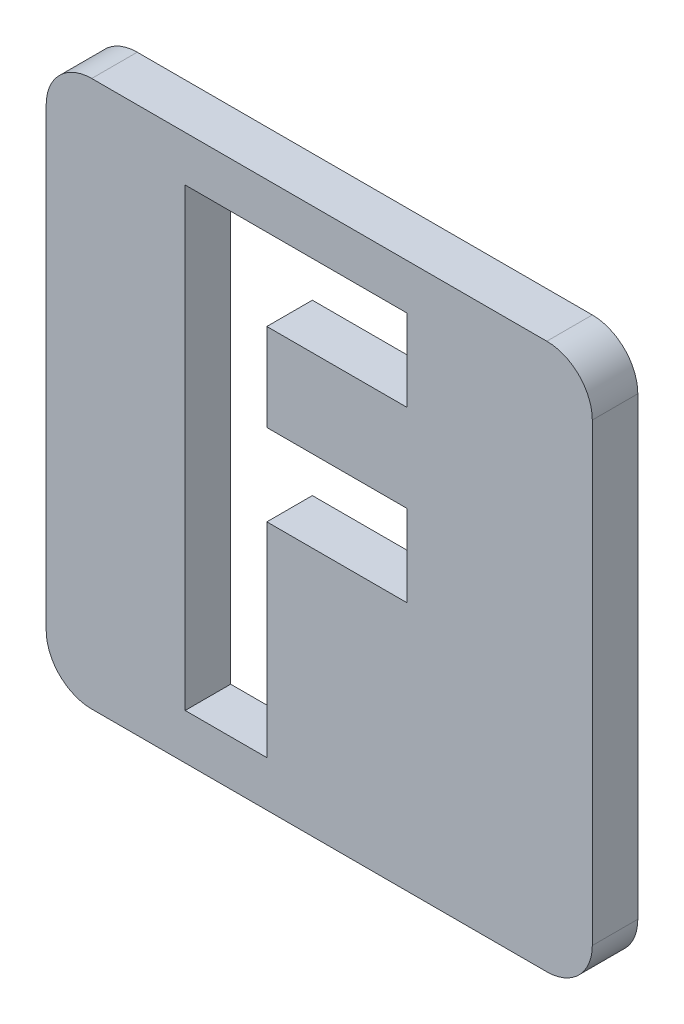
ISO-10303-21;
HEADER;
FILE_DESCRIPTION(('STEP AP214'),'2;1');
FILE_NAME('part.step','',(''),(''),'','','');
FILE_SCHEMA(('AUTOMOTIVE_DESIGN { 1 0 10303 214 1 1 1 1 }'));
ENDSEC;
DATA;
#1=APPLICATION_CONTEXT('core data for automotive mechanical design processes');
#2=APPLICATION_PROTOCOL_DEFINITION('international standard','automotive_design',2000,#1);
#3=PRODUCT_CONTEXT('',#1,'mechanical');
#4=PRODUCT('Part','Part','',(#3));
#5=PRODUCT_RELATED_PRODUCT_CATEGORY('part','',(#4));
#6=PRODUCT_DEFINITION_FORMATION('','',#4);
#7=PRODUCT_DEFINITION_CONTEXT('part definition',#1,'design');
#8=PRODUCT_DEFINITION('design','',#6,#7);
#9=PRODUCT_DEFINITION_SHAPE('','',#8);
#10=(LENGTH_UNIT() NAMED_UNIT(*) SI_UNIT(.MILLI.,.METRE.));
#11=(NAMED_UNIT(*) PLANE_ANGLE_UNIT() SI_UNIT($,.RADIAN.));
#12=(NAMED_UNIT(*) SI_UNIT($,.STERADIAN.) SOLID_ANGLE_UNIT());
#13=UNCERTAINTY_MEASURE_WITH_UNIT(LENGTH_MEASURE(1.E-05),#10,'distance_accuracy_value','');
#14=(GEOMETRIC_REPRESENTATION_CONTEXT(3) GLOBAL_UNCERTAINTY_ASSIGNED_CONTEXT((#13)) GLOBAL_UNIT_ASSIGNED_CONTEXT((#10,
#11,#12)) REPRESENTATION_CONTEXT('',''));
#15=CARTESIAN_POINT('',(0.,0.,0.));
#16=DIRECTION('',(0.,0.,1.));
#17=DIRECTION('',(1.,0.,0.));
#18=AXIS2_PLACEMENT_3D('',#15,#16,#17);
#19=CARTESIAN_POINT('',(50.,50.,10.));
#20=DIRECTION('',(0.,0.,-1.));
#21=DIRECTION('',(-1.,0.,0.));
#22=AXIS2_PLACEMENT_3D('',#19,#20,#21);
#23=PLANE('',#22);
#24=DIRECTION('',(1.,0.,0.));
#25=VECTOR('',#24,1.);
#26=CARTESIAN_POINT('',(-49.9999999999999,60.,10.));
#27=LINE('',#26,#25);
#28=CARTESIAN_POINT('',(-49.9999999999999,60.,10.));
#29=VERTEX_POINT('',#28);
#30=CARTESIAN_POINT('',(49.9999999999999,60.,10.));
#31=VERTEX_POINT('',#30);
#32=EDGE_CURVE('E239',#29,#31,#27,.T.);
#33=ORIENTED_EDGE('',*,*,#32,.F.);
#34=CARTESIAN_POINT('',(-50.,50.,10.));
#35=DIRECTION('',(0.,0.,1.));
#36=DIRECTION('',(1.,0.,0.));
#37=AXIS2_PLACEMENT_3D('',#34,#35,#36);
#38=CIRCLE('',#37,10.);
#39=CARTESIAN_POINT('',(-60.,49.9999999999999,10.));
#40=VERTEX_POINT('',#39);
#41=EDGE_CURVE('E257',#29,#40,#38,.T.);
#42=ORIENTED_EDGE('',*,*,#41,.T.);
#43=DIRECTION('',(0.,-1.,0.));
#44=VECTOR('',#43,1.);
#45=CARTESIAN_POINT('',(-60.,49.9999999999999,10.));
#46=LINE('',#45,#44);
#47=CARTESIAN_POINT('',(-60.,-49.9999999999999,10.));
#48=VERTEX_POINT('',#47);
#49=EDGE_CURVE('E255',#40,#48,#46,.T.);
#50=ORIENTED_EDGE('',*,*,#49,.T.);
#51=CARTESIAN_POINT('',(-50.,-50.,10.));
#52=DIRECTION('',(0.,0.,1.));
#53=DIRECTION('',(1.,0.,0.));
#54=AXIS2_PLACEMENT_3D('',#51,#52,#53);
#55=CIRCLE('',#54,10.);
#56=CARTESIAN_POINT('',(-49.9999999999999,-60.,10.));
#57=VERTEX_POINT('',#56);
#58=EDGE_CURVE('E253',#48,#57,#55,.T.);
#59=ORIENTED_EDGE('',*,*,#58,.T.);
#60=DIRECTION('',(1.,0.,0.));
#61=VECTOR('',#60,1.);
#62=CARTESIAN_POINT('',(-49.9999999999999,-60.,10.));
#63=LINE('',#62,#61);
#64=CARTESIAN_POINT('',(49.9999999999999,-60.,10.));
#65=VERTEX_POINT('',#64);
#66=EDGE_CURVE('E251',#57,#65,#63,.T.);
#67=ORIENTED_EDGE('',*,*,#66,.T.);
#68=CARTESIAN_POINT('',(50.,-50.,10.));
#69=DIRECTION('',(0.,0.,1.));
#70=DIRECTION('',(1.,0.,0.));
#71=AXIS2_PLACEMENT_3D('',#68,#69,#70);
#72=CIRCLE('',#71,10.);
#73=CARTESIAN_POINT('',(60.,-50.,10.));
#74=VERTEX_POINT('',#73);
#75=EDGE_CURVE('E249',#65,#74,#72,.T.);
#76=ORIENTED_EDGE('',*,*,#75,.T.);
#77=DIRECTION('',(0.,-1.,0.));
#78=VECTOR('',#77,1.);
#79=CARTESIAN_POINT('',(60.,49.9999999999999,10.));
#80=LINE('',#79,#78);
#81=CARTESIAN_POINT('',(60.,49.9999999999999,10.));
#82=VERTEX_POINT('',#81);
#83=EDGE_CURVE('E246',#82,#74,#80,.T.);
#84=ORIENTED_EDGE('',*,*,#83,.F.);
#85=CARTESIAN_POINT('',(50.,50.,10.));
#86=DIRECTION('',(0.,0.,-1.));
#87=DIRECTION('',(-1.,0.,0.));
#88=AXIS2_PLACEMENT_3D('',#85,#86,#87);
#89=CIRCLE('',#88,10.);
#90=EDGE_CURVE('E242',#31,#82,#89,.T.);
#91=ORIENTED_EDGE('',*,*,#90,.F.);
#92=EDGE_LOOP('',(#33,#42,#50,#59,#67,#76,#84,#91));
#93=FACE_BOUND('',#92,.T.);
#94=DIRECTION('',(0.,1.,0.));
#95=VECTOR('',#94,1.);
#96=CARTESIAN_POINT('',(-29.4615384615385,-50.,10.));
#97=LINE('',#96,#95);
#98=CARTESIAN_POINT('',(-29.4615384615385,-50.,10.));
#99=VERTEX_POINT('',#98);
#100=CARTESIAN_POINT('',(-29.4615384615385,50.,10.));
#101=VERTEX_POINT('',#100);
#102=EDGE_CURVE('E50',#99,#101,#97,.T.);
#103=ORIENTED_EDGE('',*,*,#102,.T.);
#104=DIRECTION('',(1.,0.,0.));
#105=VECTOR('',#104,1.);
#106=CARTESIAN_POINT('',(-29.4615384615385,50.,10.));
#107=LINE('',#106,#105);
#108=CARTESIAN_POINT('',(19.2564102564103,50.,10.));
#109=VERTEX_POINT('',#108);
#110=EDGE_CURVE('E174',#101,#109,#107,.T.);
#111=ORIENTED_EDGE('',*,*,#110,.T.);
#112=DIRECTION('',(0.,-1.,0.));
#113=VECTOR('',#112,1.);
#114=CARTESIAN_POINT('',(19.2564102564103,50.,10.));
#115=LINE('',#114,#113);
#116=CARTESIAN_POINT('',(19.2564102564103,32.0512820512821,10.));
#117=VERTEX_POINT('',#116);
#118=EDGE_CURVE('E201',#109,#117,#115,.T.);
#119=ORIENTED_EDGE('',*,*,#118,.T.);
#120=DIRECTION('',(-1.,0.,0.));
#121=VECTOR('',#120,1.);
#122=CARTESIAN_POINT('',(19.2564102564103,32.0512820512821,10.));
#123=LINE('',#122,#121);
#124=CARTESIAN_POINT('',(-11.5128205128205,32.0512820512821,10.));
#125=VERTEX_POINT('',#124);
#126=EDGE_CURVE('E204',#117,#125,#123,.T.);
#127=ORIENTED_EDGE('',*,*,#126,.T.);
#128=DIRECTION('',(0.,-1.,0.));
#129=VECTOR('',#128,1.);
#130=CARTESIAN_POINT('',(-11.5128205128205,32.0512820512821,10.));
#131=LINE('',#130,#129);
#132=CARTESIAN_POINT('',(-11.5128205128205,12.8205128205128,10.));
#133=VERTEX_POINT('',#132);
#134=EDGE_CURVE('E207',#125,#133,#131,.T.);
#135=ORIENTED_EDGE('',*,*,#134,.T.);
#136=DIRECTION('',(1.,0.,0.));
#137=VECTOR('',#136,1.);
#138=CARTESIAN_POINT('',(-11.5128205128205,12.8205128205128,10.));
#139=LINE('',#138,#137);
#140=CARTESIAN_POINT('',(19.2564102564103,12.8205128205128,10.));
#141=VERTEX_POINT('',#140);
#142=EDGE_CURVE('E210',#133,#141,#139,.T.);
#143=ORIENTED_EDGE('',*,*,#142,.T.);
#144=DIRECTION('',(0.,-1.,0.));
#145=VECTOR('',#144,1.);
#146=CARTESIAN_POINT('',(19.2564102564103,12.8205128205128,10.));
#147=LINE('',#146,#145);
#148=CARTESIAN_POINT('',(19.2564102564103,-5.12820512820513,10.));
#149=VERTEX_POINT('',#148);
#150=EDGE_CURVE('E213',#141,#149,#147,.T.);
#151=ORIENTED_EDGE('',*,*,#150,.T.);
#152=DIRECTION('',(-1.,0.,0.));
#153=VECTOR('',#152,1.);
#154=CARTESIAN_POINT('',(19.2564102564103,-5.12820512820513,10.));
#155=LINE('',#154,#153);
#156=CARTESIAN_POINT('',(-11.5128205128205,-5.12820512820513,10.));
#157=VERTEX_POINT('',#156);
#158=EDGE_CURVE('E216',#149,#157,#155,.T.);
#159=ORIENTED_EDGE('',*,*,#158,.T.);
#160=DIRECTION('',(0.,-1.,0.));
#161=VECTOR('',#160,1.);
#162=CARTESIAN_POINT('',(-11.5128205128205,-5.12820512820513,10.));
#163=LINE('',#162,#161);
#164=CARTESIAN_POINT('',(-11.5128205128205,-50.,10.));
#165=VERTEX_POINT('',#164);
#166=EDGE_CURVE('E219',#157,#165,#163,.T.);
#167=ORIENTED_EDGE('',*,*,#166,.T.);
#168=DIRECTION('',(-1.,0.,0.));
#169=VECTOR('',#168,1.);
#170=CARTESIAN_POINT('',(-11.5128205128205,-50.,10.));
#171=LINE('',#170,#169);
#172=EDGE_CURVE('E168',#165,#99,#171,.T.);
#173=ORIENTED_EDGE('',*,*,#172,.T.);
#174=EDGE_LOOP('',(#103,#111,#119,#127,#135,#143,#151,#159,#167,#173));
#175=FACE_BOUND('',#174,.T.);
#176=ADVANCED_FACE('F33',(#93,#175),#23,.F.);
#177=CARTESIAN_POINT('',(50.,50.,0.));
#178=DIRECTION('',(0.,0.,-1.));
#179=DIRECTION('',(-1.,0.,0.));
#180=AXIS2_PLACEMENT_3D('',#177,#178,#179);
#181=PLANE('',#180);
#182=DIRECTION('',(1.,0.,0.));
#183=VECTOR('',#182,1.);
#184=CARTESIAN_POINT('',(-49.9999999999999,60.,0.));
#185=LINE('',#184,#183);
#186=CARTESIAN_POINT('',(-49.9999999999999,60.,0.));
#187=VERTEX_POINT('',#186);
#188=CARTESIAN_POINT('',(49.9999999999999,60.,0.));
#189=VERTEX_POINT('',#188);
#190=EDGE_CURVE('E175',#187,#189,#185,.T.);
#191=ORIENTED_EDGE('',*,*,#190,.T.);
#192=CARTESIAN_POINT('',(50.,50.,0.));
#193=DIRECTION('',(0.,0.,-1.));
#194=DIRECTION('',(-1.,0.,0.));
#195=AXIS2_PLACEMENT_3D('',#192,#193,#194);
#196=CIRCLE('',#195,10.);
#197=CARTESIAN_POINT('',(60.,49.9999999999999,0.));
#198=VERTEX_POINT('',#197);
#199=EDGE_CURVE('E261',#189,#198,#196,.T.);
#200=ORIENTED_EDGE('',*,*,#199,.T.);
#201=DIRECTION('',(0.,-1.,0.));
#202=VECTOR('',#201,1.);
#203=CARTESIAN_POINT('',(60.,49.9999999999999,0.));
#204=LINE('',#203,#202);
#205=CARTESIAN_POINT('',(60.,-50.,0.));
#206=VERTEX_POINT('',#205);
#207=EDGE_CURVE('E264',#198,#206,#204,.T.);
#208=ORIENTED_EDGE('',*,*,#207,.T.);
#209=CARTESIAN_POINT('',(50.,-50.,0.));
#210=DIRECTION('',(0.,0.,1.));
#211=DIRECTION('',(1.,0.,0.));
#212=AXIS2_PLACEMENT_3D('',#209,#210,#211);
#213=CIRCLE('',#212,10.);
#214=CARTESIAN_POINT('',(49.9999999999999,-60.,0.));
#215=VERTEX_POINT('',#214);
#216=EDGE_CURVE('E267',#215,#206,#213,.T.);
#217=ORIENTED_EDGE('',*,*,#216,.F.);
#218=DIRECTION('',(1.,0.,0.));
#219=VECTOR('',#218,1.);
#220=CARTESIAN_POINT('',(-49.9999999999999,-60.,0.));
#221=LINE('',#220,#219);
#222=CARTESIAN_POINT('',(-49.9999999999999,-60.,0.));
#223=VERTEX_POINT('',#222);
#224=EDGE_CURVE('E270',#223,#215,#221,.T.);
#225=ORIENTED_EDGE('',*,*,#224,.F.);
#226=CARTESIAN_POINT('',(-50.,-50.,0.));
#227=DIRECTION('',(0.,0.,1.));
#228=DIRECTION('',(1.,0.,0.));
#229=AXIS2_PLACEMENT_3D('',#226,#227,#228);
#230=CIRCLE('',#229,10.);
#231=CARTESIAN_POINT('',(-60.,-49.9999999999999,0.));
#232=VERTEX_POINT('',#231);
#233=EDGE_CURVE('E272',#232,#223,#230,.T.);
#234=ORIENTED_EDGE('',*,*,#233,.F.);
#235=DIRECTION('',(0.,-1.,0.));
#236=VECTOR('',#235,1.);
#237=CARTESIAN_POINT('',(-60.,49.9999999999999,0.));
#238=LINE('',#237,#236);
#239=CARTESIAN_POINT('',(-60.,49.9999999999999,0.));
#240=VERTEX_POINT('',#239);
#241=EDGE_CURVE('E274',#240,#232,#238,.T.);
#242=ORIENTED_EDGE('',*,*,#241,.F.);
#243=CARTESIAN_POINT('',(-50.,50.,0.));
#244=DIRECTION('',(0.,0.,1.));
#245=DIRECTION('',(1.,0.,0.));
#246=AXIS2_PLACEMENT_3D('',#243,#244,#245);
#247=CIRCLE('',#246,10.);
#248=EDGE_CURVE('E243',#187,#240,#247,.T.);
#249=ORIENTED_EDGE('',*,*,#248,.F.);
#250=EDGE_LOOP('',(#191,#200,#208,#217,#225,#234,#242,#249));
#251=FACE_BOUND('',#250,.T.);
#252=DIRECTION('',(1.,0.,0.));
#253=VECTOR('',#252,1.);
#254=CARTESIAN_POINT('',(-29.4615384615385,50.,0.));
#255=LINE('',#254,#253);
#256=CARTESIAN_POINT('',(-29.4615384615385,50.,0.));
#257=VERTEX_POINT('',#256);
#258=CARTESIAN_POINT('',(19.2564102564103,50.,0.));
#259=VERTEX_POINT('',#258);
#260=EDGE_CURVE('E167',#257,#259,#255,.T.);
#261=ORIENTED_EDGE('',*,*,#260,.F.);
#262=DIRECTION('',(0.,1.,0.));
#263=VECTOR('',#262,1.);
#264=CARTESIAN_POINT('',(-29.4615384615385,-50.,0.));
#265=LINE('',#264,#263);
#266=CARTESIAN_POINT('',(-29.4615384615385,-50.,0.));
#267=VERTEX_POINT('',#266);
#268=EDGE_CURVE('E159',#267,#257,#265,.T.);
#269=ORIENTED_EDGE('',*,*,#268,.F.);
#270=DIRECTION('',(-1.,0.,0.));
#271=VECTOR('',#270,1.);
#272=CARTESIAN_POINT('',(-11.5128205128205,-50.,0.));
#273=LINE('',#272,#271);
#274=CARTESIAN_POINT('',(-11.5128205128205,-50.,0.));
#275=VERTEX_POINT('',#274);
#276=EDGE_CURVE('E197',#275,#267,#273,.T.);
#277=ORIENTED_EDGE('',*,*,#276,.F.);
#278=DIRECTION('',(0.,-1.,0.));
#279=VECTOR('',#278,1.);
#280=CARTESIAN_POINT('',(-11.5128205128205,-5.12820512820513,0.));
#281=LINE('',#280,#279);
#282=CARTESIAN_POINT('',(-11.5128205128205,-5.12820512820513,0.));
#283=VERTEX_POINT('',#282);
#284=EDGE_CURVE('E195',#283,#275,#281,.T.);
#285=ORIENTED_EDGE('',*,*,#284,.F.);
#286=DIRECTION('',(-1.,0.,0.));
#287=VECTOR('',#286,1.);
#288=CARTESIAN_POINT('',(19.2564102564103,-5.12820512820513,0.));
#289=LINE('',#288,#287);
#290=CARTESIAN_POINT('',(19.2564102564103,-5.12820512820513,0.));
#291=VERTEX_POINT('',#290);
#292=EDGE_CURVE('E193',#291,#283,#289,.T.);
#293=ORIENTED_EDGE('',*,*,#292,.F.);
#294=DIRECTION('',(0.,-1.,0.));
#295=VECTOR('',#294,1.);
#296=CARTESIAN_POINT('',(19.2564102564103,12.8205128205128,0.));
#297=LINE('',#296,#295);
#298=CARTESIAN_POINT('',(19.2564102564103,12.8205128205128,0.));
#299=VERTEX_POINT('',#298);
#300=EDGE_CURVE('E191',#299,#291,#297,.T.);
#301=ORIENTED_EDGE('',*,*,#300,.F.);
#302=DIRECTION('',(1.,0.,0.));
#303=VECTOR('',#302,1.);
#304=CARTESIAN_POINT('',(-11.5128205128205,12.8205128205128,0.));
#305=LINE('',#304,#303);
#306=CARTESIAN_POINT('',(-11.5128205128205,12.8205128205128,0.));
#307=VERTEX_POINT('',#306);
#308=EDGE_CURVE('E189',#307,#299,#305,.T.);
#309=ORIENTED_EDGE('',*,*,#308,.F.);
#310=DIRECTION('',(0.,-1.,0.));
#311=VECTOR('',#310,1.);
#312=CARTESIAN_POINT('',(-11.5128205128205,32.0512820512821,0.));
#313=LINE('',#312,#311);
#314=CARTESIAN_POINT('',(-11.5128205128205,32.0512820512821,0.));
#315=VERTEX_POINT('',#314);
#316=EDGE_CURVE('E187',#315,#307,#313,.T.);
#317=ORIENTED_EDGE('',*,*,#316,.F.);
#318=DIRECTION('',(-1.,0.,0.));
#319=VECTOR('',#318,1.);
#320=CARTESIAN_POINT('',(19.2564102564103,32.0512820512821,0.));
#321=LINE('',#320,#319);
#322=CARTESIAN_POINT('',(19.2564102564103,32.0512820512821,0.));
#323=VERTEX_POINT('',#322);
#324=EDGE_CURVE('E183',#323,#315,#321,.T.);
#325=ORIENTED_EDGE('',*,*,#324,.F.);
#326=DIRECTION('',(0.,-1.,0.));
#327=VECTOR('',#326,1.);
#328=CARTESIAN_POINT('',(19.2564102564103,50.,0.));
#329=LINE('',#328,#327);
#330=EDGE_CURVE('E181',#259,#323,#329,.T.);
#331=ORIENTED_EDGE('',*,*,#330,.F.);
#332=EDGE_LOOP('',(#261,#269,#277,#285,#293,#301,#309,#317,#325,#331));
#333=FACE_BOUND('',#332,.T.);
#334=ADVANCED_FACE('F179',(#251,#333),#181,.T.);
#335=CARTESIAN_POINT('',(-49.9999999999999,60.,10.));
#336=DIRECTION('',(0.,1.,0.));
#337=DIRECTION('',(0.,0.,1.));
#338=AXIS2_PLACEMENT_3D('',#335,#336,#337);
#339=PLANE('',#338);
#340=ORIENTED_EDGE('',*,*,#190,.F.);
#341=DIRECTION('',(0.,0.,-1.));
#342=VECTOR('',#341,1.);
#343=CARTESIAN_POINT('',(-49.9999999999999,60.,10.));
#344=LINE('',#343,#342);
#345=EDGE_CURVE('E11',#29,#187,#344,.T.);
#346=ORIENTED_EDGE('',*,*,#345,.F.);
#347=ORIENTED_EDGE('',*,*,#32,.T.);
#348=DIRECTION('',(0.,0.,-1.));
#349=VECTOR('',#348,1.);
#350=CARTESIAN_POINT('',(49.9999999999999,60.,10.));
#351=LINE('',#350,#349);
#352=EDGE_CURVE('E37',#31,#189,#351,.T.);
#353=ORIENTED_EDGE('',*,*,#352,.T.);
#354=EDGE_LOOP('',(#340,#346,#347,#353));
#355=FACE_BOUND('',#354,.T.);
#356=ADVANCED_FACE('F35',(#355),#339,.T.);
#357=CARTESIAN_POINT('',(-50.,50.,10.));
#358=DIRECTION('',(0.,0.,-1.));
#359=DIRECTION('',(-1.,0.,0.));
#360=AXIS2_PLACEMENT_3D('',#357,#358,#359);
#361=CYLINDRICAL_SURFACE('',#360,10.);
#362=ORIENTED_EDGE('',*,*,#248,.T.);
#363=DIRECTION('',(0.,0.,-1.));
#364=VECTOR('',#363,1.);
#365=CARTESIAN_POINT('',(-60.,49.9999999999999,10.));
#366=LINE('',#365,#364);
#367=EDGE_CURVE('E42',#40,#240,#366,.T.);
#368=ORIENTED_EDGE('',*,*,#367,.F.);
#369=ORIENTED_EDGE('',*,*,#41,.F.);
#370=ORIENTED_EDGE('',*,*,#345,.T.);
#371=EDGE_LOOP('',(#362,#368,#369,#370));
#372=FACE_BOUND('',#371,.T.);
#373=ADVANCED_FACE('F304',(#372),#361,.T.);
#374=CARTESIAN_POINT('',(-60.,49.9999999999999,10.));
#375=DIRECTION('',(1.,0.,0.));
#376=DIRECTION('',(0.,1.,0.));
#377=AXIS2_PLACEMENT_3D('',#374,#375,#376);
#378=PLANE('',#377);
#379=ORIENTED_EDGE('',*,*,#241,.T.);
#380=DIRECTION('',(0.,0.,-1.));
#381=VECTOR('',#380,1.);
#382=CARTESIAN_POINT('',(-60.,-49.9999999999999,10.));
#383=LINE('',#382,#381);
#384=EDGE_CURVE('E279',#48,#232,#383,.T.);
#385=ORIENTED_EDGE('',*,*,#384,.F.);
#386=ORIENTED_EDGE('',*,*,#49,.F.);
#387=ORIENTED_EDGE('',*,*,#367,.T.);
#388=EDGE_LOOP('',(#379,#385,#386,#387));
#389=FACE_BOUND('',#388,.T.);
#390=ADVANCED_FACE('F308',(#389),#378,.F.);
#391=CARTESIAN_POINT('',(-50.,-50.,10.));
#392=DIRECTION('',(0.,0.,-1.));
#393=DIRECTION('',(-1.,0.,0.));
#394=AXIS2_PLACEMENT_3D('',#391,#392,#393);
#395=CYLINDRICAL_SURFACE('',#394,10.);
#396=ORIENTED_EDGE('',*,*,#233,.T.);
#397=DIRECTION('',(0.,0.,-1.));
#398=VECTOR('',#397,1.);
#399=CARTESIAN_POINT('',(-49.9999999999999,-60.,10.));
#400=LINE('',#399,#398);
#401=EDGE_CURVE('E282',#57,#223,#400,.T.);
#402=ORIENTED_EDGE('',*,*,#401,.F.);
#403=ORIENTED_EDGE('',*,*,#58,.F.);
#404=ORIENTED_EDGE('',*,*,#384,.T.);
#405=EDGE_LOOP('',(#396,#402,#403,#404));
#406=FACE_BOUND('',#405,.T.);
#407=ADVANCED_FACE('F328',(#406),#395,.T.);
#408=CARTESIAN_POINT('',(-49.9999999999999,-60.,10.));
#409=DIRECTION('',(0.,1.,0.));
#410=DIRECTION('',(0.,0.,1.));
#411=AXIS2_PLACEMENT_3D('',#408,#409,#410);
#412=PLANE('',#411);
#413=ORIENTED_EDGE('',*,*,#224,.T.);
#414=DIRECTION('',(0.,0.,-1.));
#415=VECTOR('',#414,1.);
#416=CARTESIAN_POINT('',(49.9999999999999,-60.,10.));
#417=LINE('',#416,#415);
#418=EDGE_CURVE('E285',#65,#215,#417,.T.);
#419=ORIENTED_EDGE('',*,*,#418,.F.);
#420=ORIENTED_EDGE('',*,*,#66,.F.);
#421=ORIENTED_EDGE('',*,*,#401,.T.);
#422=EDGE_LOOP('',(#413,#419,#420,#421));
#423=FACE_BOUND('',#422,.T.);
#424=ADVANCED_FACE('F326',(#423),#412,.F.);
#425=CARTESIAN_POINT('',(50.,-50.,10.));
#426=DIRECTION('',(0.,0.,-1.));
#427=DIRECTION('',(-1.,0.,0.));
#428=AXIS2_PLACEMENT_3D('',#425,#426,#427);
#429=CYLINDRICAL_SURFACE('',#428,10.);
#430=ORIENTED_EDGE('',*,*,#216,.T.);
#431=DIRECTION('',(0.,0.,-1.));
#432=VECTOR('',#431,1.);
#433=CARTESIAN_POINT('',(60.,-50.,10.));
#434=LINE('',#433,#432);
#435=EDGE_CURVE('E288',#74,#206,#434,.T.);
#436=ORIENTED_EDGE('',*,*,#435,.F.);
#437=ORIENTED_EDGE('',*,*,#75,.F.);
#438=ORIENTED_EDGE('',*,*,#418,.T.);
#439=EDGE_LOOP('',(#430,#436,#437,#438));
#440=FACE_BOUND('',#439,.T.);
#441=ADVANCED_FACE('F322',(#440),#429,.T.);
#442=CARTESIAN_POINT('',(60.,49.9999999999999,10.));
#443=DIRECTION('',(1.,0.,0.));
#444=DIRECTION('',(0.,1.,0.));
#445=AXIS2_PLACEMENT_3D('',#442,#443,#444);
#446=PLANE('',#445);
#447=ORIENTED_EDGE('',*,*,#207,.F.);
#448=DIRECTION('',(0.,0.,-1.));
#449=VECTOR('',#448,1.);
#450=CARTESIAN_POINT('',(60.,49.9999999999999,10.));
#451=LINE('',#450,#449);
#452=EDGE_CURVE('E289',#82,#198,#451,.T.);
#453=ORIENTED_EDGE('',*,*,#452,.F.);
#454=ORIENTED_EDGE('',*,*,#83,.T.);
#455=ORIENTED_EDGE('',*,*,#435,.T.);
#456=EDGE_LOOP('',(#447,#453,#454,#455));
#457=FACE_BOUND('',#456,.T.);
#458=ADVANCED_FACE('F318',(#457),#446,.T.);
#459=CARTESIAN_POINT('',(50.,50.,10.));
#460=DIRECTION('',(0.,0.,-1.));
#461=DIRECTION('',(-1.,0.,0.));
#462=AXIS2_PLACEMENT_3D('',#459,#460,#461);
#463=CYLINDRICAL_SURFACE('',#462,10.);
#464=ORIENTED_EDGE('',*,*,#199,.F.);
#465=ORIENTED_EDGE('',*,*,#352,.F.);
#466=ORIENTED_EDGE('',*,*,#90,.T.);
#467=ORIENTED_EDGE('',*,*,#452,.T.);
#468=EDGE_LOOP('',(#464,#465,#466,#467));
#469=FACE_BOUND('',#468,.T.);
#470=ADVANCED_FACE('F297',(#469),#463,.T.);
#471=CARTESIAN_POINT('',(-29.4615384615385,-50.,0.));
#472=DIRECTION('',(1.,0.,0.));
#473=DIRECTION('',(0.,0.,-1.));
#474=AXIS2_PLACEMENT_3D('',#471,#472,#473);
#475=PLANE('',#474);
#476=ORIENTED_EDGE('',*,*,#102,.F.);
#477=DIRECTION('',(0.,0.,1.));
#478=VECTOR('',#477,1.);
#479=CARTESIAN_POINT('',(-29.4615384615385,-50.,0.));
#480=LINE('',#479,#478);
#481=EDGE_CURVE('E163',#267,#99,#480,.T.);
#482=ORIENTED_EDGE('',*,*,#481,.F.);
#483=ORIENTED_EDGE('',*,*,#268,.T.);
#484=DIRECTION('',(0.,0.,1.));
#485=VECTOR('',#484,1.);
#486=CARTESIAN_POINT('',(-29.4615384615385,50.,0.));
#487=LINE('',#486,#485);
#488=EDGE_CURVE('E162',#257,#101,#487,.T.);
#489=ORIENTED_EDGE('',*,*,#488,.T.);
#490=EDGE_LOOP('',(#476,#482,#483,#489));
#491=FACE_BOUND('',#490,.T.);
#492=ADVANCED_FACE('F161',(#491),#475,.T.);
#493=CARTESIAN_POINT('',(-29.4615384615385,50.,0.));
#494=DIRECTION('',(0.,-1.,0.));
#495=DIRECTION('',(0.,0.,-1.));
#496=AXIS2_PLACEMENT_3D('',#493,#494,#495);
#497=PLANE('',#496);
#498=ORIENTED_EDGE('',*,*,#110,.F.);
#499=ORIENTED_EDGE('',*,*,#488,.F.);
#500=ORIENTED_EDGE('',*,*,#260,.T.);
#501=DIRECTION('',(0.,0.,1.));
#502=VECTOR('',#501,1.);
#503=CARTESIAN_POINT('',(19.2564102564103,50.,0.));
#504=LINE('',#503,#502);
#505=EDGE_CURVE('E176',#259,#109,#504,.T.);
#506=ORIENTED_EDGE('',*,*,#505,.T.);
#507=EDGE_LOOP('',(#498,#499,#500,#506));
#508=FACE_BOUND('',#507,.T.);
#509=ADVANCED_FACE('F171',(#508),#497,.T.);
#510=CARTESIAN_POINT('',(19.2564102564103,50.,0.));
#511=DIRECTION('',(-1.,0.,0.));
#512=DIRECTION('',(0.,0.,1.));
#513=AXIS2_PLACEMENT_3D('',#510,#511,#512);
#514=PLANE('',#513);
#515=ORIENTED_EDGE('',*,*,#118,.F.);
#516=ORIENTED_EDGE('',*,*,#505,.F.);
#517=ORIENTED_EDGE('',*,*,#330,.T.);
#518=DIRECTION('',(0.,0.,1.));
#519=VECTOR('',#518,1.);
#520=CARTESIAN_POINT('',(19.2564102564103,32.0512820512821,0.));
#521=LINE('',#520,#519);
#522=EDGE_CURVE('E236',#323,#117,#521,.T.);
#523=ORIENTED_EDGE('',*,*,#522,.T.);
#524=EDGE_LOOP('',(#515,#516,#517,#523));
#525=FACE_BOUND('',#524,.T.);
#526=ADVANCED_FACE('F377',(#525),#514,.T.);
#527=CARTESIAN_POINT('',(19.2564102564103,32.0512820512821,0.));
#528=DIRECTION('',(0.,1.,0.));
#529=DIRECTION('',(0.,0.,1.));
#530=AXIS2_PLACEMENT_3D('',#527,#528,#529);
#531=PLANE('',#530);
#532=ORIENTED_EDGE('',*,*,#126,.F.);
#533=ORIENTED_EDGE('',*,*,#522,.F.);
#534=ORIENTED_EDGE('',*,*,#324,.T.);
#535=DIRECTION('',(0.,0.,1.));
#536=VECTOR('',#535,1.);
#537=CARTESIAN_POINT('',(-11.5128205128205,32.0512820512821,0.));
#538=LINE('',#537,#536);
#539=EDGE_CURVE('E234',#315,#125,#538,.T.);
#540=ORIENTED_EDGE('',*,*,#539,.T.);
#541=EDGE_LOOP('',(#532,#533,#534,#540));
#542=FACE_BOUND('',#541,.T.);
#543=ADVANCED_FACE('F385',(#542),#531,.T.);
#544=CARTESIAN_POINT('',(-11.5128205128205,32.0512820512821,0.));
#545=DIRECTION('',(-1.,0.,0.));
#546=DIRECTION('',(0.,0.,1.));
#547=AXIS2_PLACEMENT_3D('',#544,#545,#546);
#548=PLANE('',#547);
#549=ORIENTED_EDGE('',*,*,#134,.F.);
#550=ORIENTED_EDGE('',*,*,#539,.F.);
#551=ORIENTED_EDGE('',*,*,#316,.T.);
#552=DIRECTION('',(0.,0.,1.));
#553=VECTOR('',#552,1.);
#554=CARTESIAN_POINT('',(-11.5128205128205,12.8205128205128,0.));
#555=LINE('',#554,#553);
#556=EDGE_CURVE('E232',#307,#133,#555,.T.);
#557=ORIENTED_EDGE('',*,*,#556,.T.);
#558=EDGE_LOOP('',(#549,#550,#551,#557));
#559=FACE_BOUND('',#558,.T.);
#560=ADVANCED_FACE('F395',(#559),#548,.T.);
#561=CARTESIAN_POINT('',(-11.5128205128205,12.8205128205128,0.));
#562=DIRECTION('',(0.,-1.,0.));
#563=DIRECTION('',(0.,0.,-1.));
#564=AXIS2_PLACEMENT_3D('',#561,#562,#563);
#565=PLANE('',#564);
#566=ORIENTED_EDGE('',*,*,#142,.F.);
#567=ORIENTED_EDGE('',*,*,#556,.F.);
#568=ORIENTED_EDGE('',*,*,#308,.T.);
#569=DIRECTION('',(0.,0.,1.));
#570=VECTOR('',#569,1.);
#571=CARTESIAN_POINT('',(19.2564102564103,12.8205128205128,0.));
#572=LINE('',#571,#570);
#573=EDGE_CURVE('E230',#299,#141,#572,.T.);
#574=ORIENTED_EDGE('',*,*,#573,.T.);
#575=EDGE_LOOP('',(#566,#567,#568,#574));
#576=FACE_BOUND('',#575,.T.);
#577=ADVANCED_FACE('F405',(#576),#565,.T.);
#578=CARTESIAN_POINT('',(19.2564102564103,12.8205128205128,0.));
#579=DIRECTION('',(-1.,0.,0.));
#580=DIRECTION('',(0.,0.,1.));
#581=AXIS2_PLACEMENT_3D('',#578,#579,#580);
#582=PLANE('',#581);
#583=ORIENTED_EDGE('',*,*,#150,.F.);
#584=ORIENTED_EDGE('',*,*,#573,.F.);
#585=ORIENTED_EDGE('',*,*,#300,.T.);
#586=DIRECTION('',(0.,0.,1.));
#587=VECTOR('',#586,1.);
#588=CARTESIAN_POINT('',(19.2564102564103,-5.12820512820513,0.));
#589=LINE('',#588,#587);
#590=EDGE_CURVE('E228',#291,#149,#589,.T.);
#591=ORIENTED_EDGE('',*,*,#590,.T.);
#592=EDGE_LOOP('',(#583,#584,#585,#591));
#593=FACE_BOUND('',#592,.T.);
#594=ADVANCED_FACE('F415',(#593),#582,.T.);
#595=CARTESIAN_POINT('',(19.2564102564103,-5.12820512820513,0.));
#596=DIRECTION('',(0.,1.,0.));
#597=DIRECTION('',(0.,0.,1.));
#598=AXIS2_PLACEMENT_3D('',#595,#596,#597);
#599=PLANE('',#598);
#600=ORIENTED_EDGE('',*,*,#158,.F.);
#601=ORIENTED_EDGE('',*,*,#590,.F.);
#602=ORIENTED_EDGE('',*,*,#292,.T.);
#603=DIRECTION('',(0.,0.,1.));
#604=VECTOR('',#603,1.);
#605=CARTESIAN_POINT('',(-11.5128205128205,-5.12820512820513,0.));
#606=LINE('',#605,#604);
#607=EDGE_CURVE('E226',#283,#157,#606,.T.);
#608=ORIENTED_EDGE('',*,*,#607,.T.);
#609=EDGE_LOOP('',(#600,#601,#602,#608));
#610=FACE_BOUND('',#609,.T.);
#611=ADVANCED_FACE('F425',(#610),#599,.T.);
#612=CARTESIAN_POINT('',(-11.5128205128205,-5.12820512820513,0.));
#613=DIRECTION('',(-1.,0.,0.));
#614=DIRECTION('',(0.,0.,1.));
#615=AXIS2_PLACEMENT_3D('',#612,#613,#614);
#616=PLANE('',#615);
#617=ORIENTED_EDGE('',*,*,#166,.F.);
#618=ORIENTED_EDGE('',*,*,#607,.F.);
#619=ORIENTED_EDGE('',*,*,#284,.T.);
#620=DIRECTION('',(0.,0.,1.));
#621=VECTOR('',#620,1.);
#622=CARTESIAN_POINT('',(-11.5128205128205,-50.,0.));
#623=LINE('',#622,#621);
#624=EDGE_CURVE('E58',#275,#165,#623,.T.);
#625=ORIENTED_EDGE('',*,*,#624,.T.);
#626=EDGE_LOOP('',(#617,#618,#619,#625));
#627=FACE_BOUND('',#626,.T.);
#628=ADVANCED_FACE('F435',(#627),#616,.T.);
#629=CARTESIAN_POINT('',(-11.5128205128205,-50.,0.));
#630=DIRECTION('',(0.,1.,0.));
#631=DIRECTION('',(0.,0.,1.));
#632=AXIS2_PLACEMENT_3D('',#629,#630,#631);
#633=PLANE('',#632);
#634=ORIENTED_EDGE('',*,*,#172,.F.);
#635=ORIENTED_EDGE('',*,*,#624,.F.);
#636=ORIENTED_EDGE('',*,*,#276,.T.);
#637=ORIENTED_EDGE('',*,*,#481,.T.);
#638=EDGE_LOOP('',(#634,#635,#636,#637));
#639=FACE_BOUND('',#638,.T.);
#640=ADVANCED_FACE('F445',(#639),#633,.T.);
#641=CLOSED_SHELL('',(#176,#334,#356,#373,#390,#407,#424,#441,#458,#470,#492,#509,#526,#543,
#560,#577,#594,#611,#628,#640));
#642=MANIFOLD_SOLID_BREP('B2',#641);
#643=ADVANCED_BREP_SHAPE_REPRESENTATION('',(#18,#642),#14);
#644=SHAPE_DEFINITION_REPRESENTATION(#9,#643);
ENDSEC;
END-ISO-10303-21;
